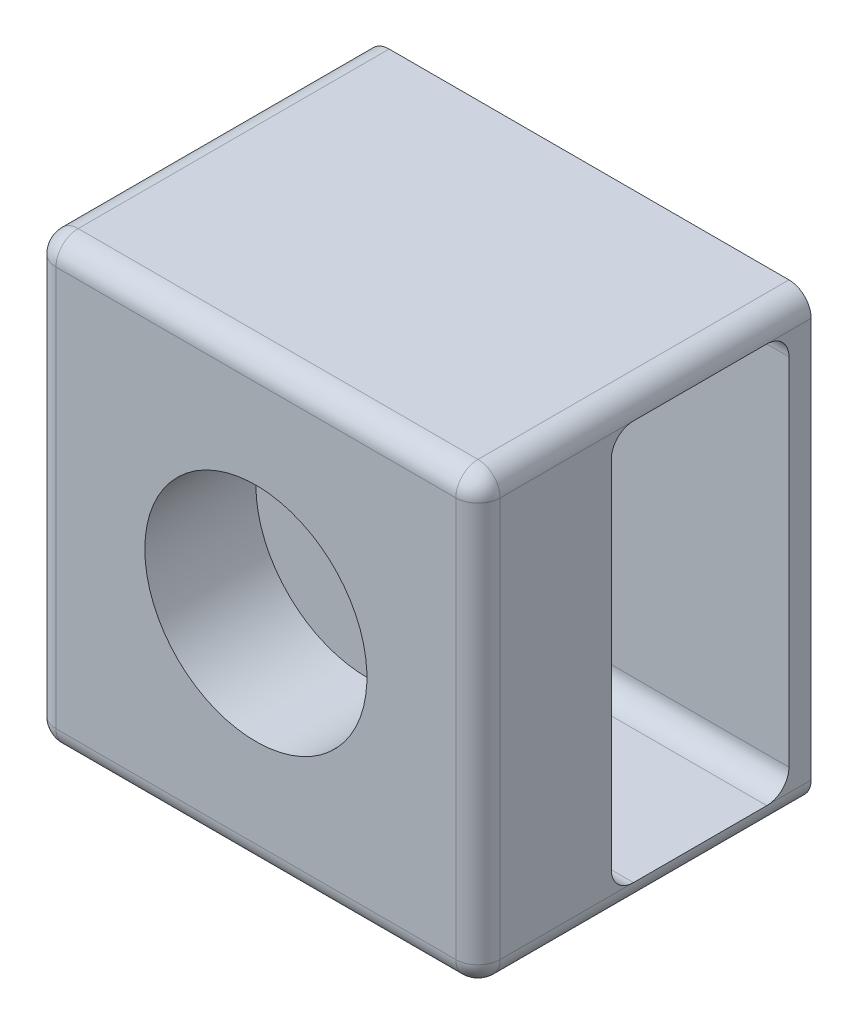
ISO-10303-21;
HEADER;
FILE_DESCRIPTION(('STEP AP214'),'2;1');
FILE_NAME('part.step','',(''),(''),'','','');
FILE_SCHEMA(('AUTOMOTIVE_DESIGN { 1 0 10303 214 1 1 1 1 }'));
ENDSEC;
DATA;
#1=APPLICATION_CONTEXT('core data for automotive mechanical design processes');
#2=APPLICATION_PROTOCOL_DEFINITION('international standard','automotive_design',2000,#1);
#3=PRODUCT_CONTEXT('',#1,'mechanical');
#4=PRODUCT('Part','Part','',(#3));
#5=PRODUCT_RELATED_PRODUCT_CATEGORY('part','',(#4));
#6=PRODUCT_DEFINITION_FORMATION('','',#4);
#7=PRODUCT_DEFINITION_CONTEXT('part definition',#1,'design');
#8=PRODUCT_DEFINITION('design','',#6,#7);
#9=PRODUCT_DEFINITION_SHAPE('','',#8);
#10=(LENGTH_UNIT() NAMED_UNIT(*) SI_UNIT(.MILLI.,.METRE.));
#11=(NAMED_UNIT(*) PLANE_ANGLE_UNIT() SI_UNIT($,.RADIAN.));
#12=(NAMED_UNIT(*) SI_UNIT($,.STERADIAN.) SOLID_ANGLE_UNIT());
#13=UNCERTAINTY_MEASURE_WITH_UNIT(LENGTH_MEASURE(1.E-05),#10,'distance_accuracy_value','');
#14=(GEOMETRIC_REPRESENTATION_CONTEXT(3) GLOBAL_UNCERTAINTY_ASSIGNED_CONTEXT((#13)) GLOBAL_UNIT_ASSIGNED_CONTEXT((#10,
#11,#12)) REPRESENTATION_CONTEXT('',''));
#15=CARTESIAN_POINT('',(0.,0.,0.));
#16=DIRECTION('',(0.,0.,1.));
#17=DIRECTION('',(1.,0.,0.));
#18=AXIS2_PLACEMENT_3D('',#15,#16,#17);
#19=CARTESIAN_POINT('',(-12.7,2.54,-12.7));
#20=DIRECTION('',(1.,0.,0.));
#21=DIRECTION('',(0.,1.,0.));
#22=AXIS2_PLACEMENT_3D('',#19,#20,#21);
#23=PLANE('',#22);
#24=DIRECTION('',(0.,1.,0.));
#25=VECTOR('',#24,1.);
#26=CARTESIAN_POINT('',(-12.7,2.54,-12.7));
#27=LINE('',#26,#25);
#28=CARTESIAN_POINT('',(-12.7,-8.89,-12.7));
#29=VERTEX_POINT('',#28);
#30=CARTESIAN_POINT('',(-12.7,13.97,-12.7));
#31=VERTEX_POINT('',#30);
#32=EDGE_CURVE('E258',#29,#31,#27,.T.);
#33=ORIENTED_EDGE('',*,*,#32,.F.);
#34=DIRECTION('',(0.,0.,1.));
#35=VECTOR('',#34,1.);
#36=CARTESIAN_POINT('',(-12.7,-8.89,-12.7));
#37=LINE('',#36,#35);
#38=CARTESIAN_POINT('',(-12.7,-8.89,-10.16));
#39=VERTEX_POINT('',#38);
#40=EDGE_CURVE('E10',#29,#39,#37,.T.);
#41=ORIENTED_EDGE('',*,*,#40,.T.);
#42=CARTESIAN_POINT('',(-12.7,-7.62,-10.16));
#43=DIRECTION('',(1.,0.,0.));
#44=DIRECTION('',(0.,1.,0.));
#45=AXIS2_PLACEMENT_3D('',#42,#43,#44);
#46=CIRCLE('',#45,1.27);
#47=CARTESIAN_POINT('',(-12.7,-7.62,-11.43));
#48=VERTEX_POINT('',#47);
#49=EDGE_CURVE('E363',#39,#48,#46,.T.);
#50=ORIENTED_EDGE('',*,*,#49,.T.);
#51=DIRECTION('',(0.,-1.,0.));
#52=VECTOR('',#51,1.);
#53=CARTESIAN_POINT('',(-12.7,2.54,-11.43));
#54=LINE('',#53,#52);
#55=CARTESIAN_POINT('',(-12.7,12.7,-11.43));
#56=VERTEX_POINT('',#55);
#57=EDGE_CURVE('E274',#56,#48,#54,.T.);
#58=ORIENTED_EDGE('',*,*,#57,.F.);
#59=CARTESIAN_POINT('',(-12.7,12.7,-10.16));
#60=DIRECTION('',(1.,0.,0.));
#61=DIRECTION('',(0.,1.,0.));
#62=AXIS2_PLACEMENT_3D('',#59,#60,#61);
#63=CIRCLE('',#62,1.27);
#64=CARTESIAN_POINT('',(-12.7,13.97,-10.16));
#65=VERTEX_POINT('',#64);
#66=EDGE_CURVE('E194',#56,#65,#63,.T.);
#67=ORIENTED_EDGE('',*,*,#66,.T.);
#68=DIRECTION('',(0.,0.,1.));
#69=VECTOR('',#68,1.);
#70=CARTESIAN_POINT('',(-12.7,13.97,-12.7));
#71=LINE('',#70,#69);
#72=EDGE_CURVE('E373',#65,#31,#71,.F.);
#73=ORIENTED_EDGE('',*,*,#72,.T.);
#74=EDGE_LOOP('',(#33,#41,#50,#58,#67,#73));
#75=FACE_BOUND('',#74,.T.);
#76=ADVANCED_FACE('F16',(#75),#23,.F.);
#77=CARTESIAN_POINT('',(12.7,2.54,-12.7));
#78=DIRECTION('',(1.,0.,0.));
#79=DIRECTION('',(0.,1.,0.));
#80=AXIS2_PLACEMENT_3D('',#77,#78,#79);
#81=PLANE('',#80);
#82=DIRECTION('',(0.,1.,0.));
#83=VECTOR('',#82,1.);
#84=CARTESIAN_POINT('',(12.7,-10.16,5.08));
#85=LINE('',#84,#83);
#86=CARTESIAN_POINT('',(12.7,13.97,5.08));
#87=VERTEX_POINT('',#86);
#88=CARTESIAN_POINT('',(12.7,-8.89,5.08));
#89=VERTEX_POINT('',#88);
#90=EDGE_CURVE('E39',#87,#89,#85,.F.);
#91=ORIENTED_EDGE('',*,*,#90,.T.);
#92=DIRECTION('',(0.,0.,1.));
#93=VECTOR('',#92,1.);
#94=CARTESIAN_POINT('',(12.7,-8.89,-12.7));
#95=LINE('',#94,#93);
#96=CARTESIAN_POINT('',(12.7,-8.89,-2.54));
#97=VERTEX_POINT('',#96);
#98=EDGE_CURVE('E370',#89,#97,#95,.F.);
#99=ORIENTED_EDGE('',*,*,#98,.T.);
#100=CARTESIAN_POINT('',(12.7,-7.62,-2.54));
#101=DIRECTION('',(1.,0.,0.));
#102=DIRECTION('',(0.,1.,0.));
#103=AXIS2_PLACEMENT_3D('',#100,#101,#102);
#104=CIRCLE('',#103,1.27);
#105=CARTESIAN_POINT('',(12.7,-7.62,-1.27));
#106=VERTEX_POINT('',#105);
#107=EDGE_CURVE('E354',#97,#106,#104,.F.);
#108=ORIENTED_EDGE('',*,*,#107,.T.);
#109=DIRECTION('',(0.,-1.,0.));
#110=VECTOR('',#109,1.);
#111=CARTESIAN_POINT('',(12.7,2.54,-1.27));
#112=LINE('',#111,#110);
#113=CARTESIAN_POINT('',(12.7,12.7,-1.27));
#114=VERTEX_POINT('',#113);
#115=EDGE_CURVE('E225',#114,#106,#112,.T.);
#116=ORIENTED_EDGE('',*,*,#115,.F.);
#117=CARTESIAN_POINT('',(12.7,12.7,-2.54));
#118=DIRECTION('',(1.,0.,0.));
#119=DIRECTION('',(0.,1.,0.));
#120=AXIS2_PLACEMENT_3D('',#117,#118,#119);
#121=CIRCLE('',#120,1.27);
#122=CARTESIAN_POINT('',(12.7,13.97,-2.54));
#123=VERTEX_POINT('',#122);
#124=EDGE_CURVE('E348',#114,#123,#121,.F.);
#125=ORIENTED_EDGE('',*,*,#124,.T.);
#126=DIRECTION('',(0.,0.,1.));
#127=VECTOR('',#126,1.);
#128=CARTESIAN_POINT('',(12.7,13.97,-12.7));
#129=LINE('',#128,#127);
#130=EDGE_CURVE('E48',#123,#87,#129,.T.);
#131=ORIENTED_EDGE('',*,*,#130,.T.);
#132=EDGE_LOOP('',(#91,#99,#108,#116,#125,#131));
#133=FACE_BOUND('',#132,.T.);
#134=ADVANCED_FACE('F492',(#133),#81,.T.);
#135=CARTESIAN_POINT('',(12.7,-7.62,-10.16));
#136=DIRECTION('',(1.,0.,0.));
#137=DIRECTION('',(0.,1.,0.));
#138=AXIS2_PLACEMENT_3D('',#135,#136,#137);
#139=CIRCLE('',#138,1.27);
#140=CARTESIAN_POINT('',(12.7,-7.62,-11.43));
#141=VERTEX_POINT('',#140);
#142=CARTESIAN_POINT('',(12.7,-8.89,-10.16));
#143=VERTEX_POINT('',#142);
#144=EDGE_CURVE('E360',#141,#143,#139,.F.);
#145=ORIENTED_EDGE('',*,*,#144,.T.);
#146=DIRECTION('',(0.,0.,1.));
#147=VECTOR('',#146,1.);
#148=CARTESIAN_POINT('',(12.7,-8.89,-12.7));
#149=LINE('',#148,#147);
#150=CARTESIAN_POINT('',(12.7,-8.89,-12.7));
#151=VERTEX_POINT('',#150);
#152=EDGE_CURVE('E207',#143,#151,#149,.F.);
#153=ORIENTED_EDGE('',*,*,#152,.T.);
#154=DIRECTION('',(0.,1.,0.));
#155=VECTOR('',#154,1.);
#156=CARTESIAN_POINT('',(12.7,2.54,-12.7));
#157=LINE('',#156,#155);
#158=CARTESIAN_POINT('',(12.7,13.97,-12.7));
#159=VERTEX_POINT('',#158);
#160=EDGE_CURVE('E202',#151,#159,#157,.T.);
#161=ORIENTED_EDGE('',*,*,#160,.T.);
#162=DIRECTION('',(0.,0.,1.));
#163=VECTOR('',#162,1.);
#164=CARTESIAN_POINT('',(12.7,13.97,-12.7));
#165=LINE('',#164,#163);
#166=CARTESIAN_POINT('',(12.7,13.97,-10.16));
#167=VERTEX_POINT('',#166);
#168=EDGE_CURVE('E199',#159,#167,#165,.T.);
#169=ORIENTED_EDGE('',*,*,#168,.T.);
#170=CARTESIAN_POINT('',(12.7,12.7,-10.16));
#171=DIRECTION('',(1.,0.,0.));
#172=DIRECTION('',(0.,1.,0.));
#173=AXIS2_PLACEMENT_3D('',#170,#171,#172);
#174=CIRCLE('',#173,1.27);
#175=CARTESIAN_POINT('',(12.7,12.7,-11.43));
#176=VERTEX_POINT('',#175);
#177=EDGE_CURVE('E182',#167,#176,#174,.F.);
#178=ORIENTED_EDGE('',*,*,#177,.T.);
#179=DIRECTION('',(0.,-1.,0.));
#180=VECTOR('',#179,1.);
#181=CARTESIAN_POINT('',(12.7,2.54,-11.43));
#182=LINE('',#181,#180);
#183=EDGE_CURVE('E226',#176,#141,#182,.T.);
#184=ORIENTED_EDGE('',*,*,#183,.T.);
#185=EDGE_LOOP('',(#145,#153,#161,#169,#178,#184));
#186=FACE_BOUND('',#185,.T.);
#187=ADVANCED_FACE('F200',(#186),#81,.T.);
#188=CARTESIAN_POINT('',(-12.7,-7.62,-2.54));
#189=DIRECTION('',(1.,0.,0.));
#190=DIRECTION('',(0.,1.,0.));
#191=AXIS2_PLACEMENT_3D('',#188,#189,#190);
#192=CIRCLE('',#191,1.27);
#193=CARTESIAN_POINT('',(-12.7,-7.62,-1.27));
#194=VERTEX_POINT('',#193);
#195=CARTESIAN_POINT('',(-12.7,-8.89,-2.54));
#196=VERTEX_POINT('',#195);
#197=EDGE_CURVE('E357',#194,#196,#192,.T.);
#198=ORIENTED_EDGE('',*,*,#197,.T.);
#199=DIRECTION('',(0.,0.,1.));
#200=VECTOR('',#199,1.);
#201=CARTESIAN_POINT('',(-12.7,-8.89,-12.7));
#202=LINE('',#201,#200);
#203=CARTESIAN_POINT('',(-12.7,-8.89,5.08));
#204=VERTEX_POINT('',#203);
#205=EDGE_CURVE('E26',#196,#204,#202,.T.);
#206=ORIENTED_EDGE('',*,*,#205,.T.);
#207=DIRECTION('',(0.,1.,0.));
#208=VECTOR('',#207,1.);
#209=CARTESIAN_POINT('',(-12.7,2.54,5.08));
#210=LINE('',#209,#208);
#211=CARTESIAN_POINT('',(-12.7,13.97,5.08));
#212=VERTEX_POINT('',#211);
#213=EDGE_CURVE('E321',#204,#212,#210,.T.);
#214=ORIENTED_EDGE('',*,*,#213,.T.);
#215=DIRECTION('',(0.,0.,1.));
#216=VECTOR('',#215,1.);
#217=CARTESIAN_POINT('',(-12.7,13.97,-12.7));
#218=LINE('',#217,#216);
#219=CARTESIAN_POINT('',(-12.7,13.97,-2.54));
#220=VERTEX_POINT('',#219);
#221=EDGE_CURVE('E376',#212,#220,#218,.F.);
#222=ORIENTED_EDGE('',*,*,#221,.T.);
#223=CARTESIAN_POINT('',(-12.7,12.7,-2.54));
#224=DIRECTION('',(1.,0.,0.));
#225=DIRECTION('',(0.,1.,0.));
#226=AXIS2_PLACEMENT_3D('',#223,#224,#225);
#227=CIRCLE('',#226,1.27);
#228=CARTESIAN_POINT('',(-12.7,12.7,-1.27));
#229=VERTEX_POINT('',#228);
#230=EDGE_CURVE('E351',#220,#229,#227,.T.);
#231=ORIENTED_EDGE('',*,*,#230,.T.);
#232=DIRECTION('',(0.,-1.,0.));
#233=VECTOR('',#232,1.);
#234=CARTESIAN_POINT('',(-12.7,2.54,-1.27));
#235=LINE('',#234,#233);
#236=EDGE_CURVE('E268',#229,#194,#235,.T.);
#237=ORIENTED_EDGE('',*,*,#236,.T.);
#238=EDGE_LOOP('',(#198,#206,#214,#222,#231,#237));
#239=FACE_BOUND('',#238,.T.);
#240=ADVANCED_FACE('F500',(#239),#23,.F.);
#241=CARTESIAN_POINT('',(0.,-10.16,-12.7));
#242=DIRECTION('',(0.,1.,0.));
#243=DIRECTION('',(-1.,0.,0.));
#244=AXIS2_PLACEMENT_3D('',#241,#242,#243);
#245=PLANE('',#244);
#246=DIRECTION('',(-1.,0.,0.));
#247=VECTOR('',#246,1.);
#248=CARTESIAN_POINT('',(0.,-10.16,-12.7));
#249=LINE('',#248,#247);
#250=CARTESIAN_POINT('',(11.43,-10.16,-12.7));
#251=VERTEX_POINT('',#250);
#252=CARTESIAN_POINT('',(-11.43,-10.16,-12.7));
#253=VERTEX_POINT('',#252);
#254=EDGE_CURVE('E254',#251,#253,#249,.T.);
#255=ORIENTED_EDGE('',*,*,#254,.F.);
#256=DIRECTION('',(0.,0.,1.));
#257=VECTOR('',#256,1.);
#258=CARTESIAN_POINT('',(11.43,-10.16,6.35));
#259=LINE('',#258,#257);
#260=CARTESIAN_POINT('',(11.43,-10.16,5.08));
#261=VERTEX_POINT('',#260);
#262=EDGE_CURVE('E330',#251,#261,#259,.T.);
#263=ORIENTED_EDGE('',*,*,#262,.T.);
#264=DIRECTION('',(-1.,0.,0.));
#265=VECTOR('',#264,1.);
#266=CARTESIAN_POINT('',(0.,-10.16,5.08));
#267=LINE('',#266,#265);
#268=CARTESIAN_POINT('',(-11.43,-10.16,5.08));
#269=VERTEX_POINT('',#268);
#270=EDGE_CURVE('E327',#261,#269,#267,.T.);
#271=ORIENTED_EDGE('',*,*,#270,.T.);
#272=DIRECTION('',(0.,0.,1.));
#273=VECTOR('',#272,1.);
#274=CARTESIAN_POINT('',(-11.43,-10.16,-12.7));
#275=LINE('',#274,#273);
#276=EDGE_CURVE('E324',#269,#253,#275,.F.);
#277=ORIENTED_EDGE('',*,*,#276,.T.);
#278=EDGE_LOOP('',(#255,#263,#271,#277));
#279=FACE_BOUND('',#278,.T.);
#280=ADVANCED_FACE('F451',(#279),#245,.F.);
#281=CARTESIAN_POINT('',(0.,15.24,-12.7));
#282=DIRECTION('',(0.,1.,0.));
#283=DIRECTION('',(-1.,0.,0.));
#284=AXIS2_PLACEMENT_3D('',#281,#282,#283);
#285=PLANE('',#284);
#286=DIRECTION('',(-1.,0.,0.));
#287=VECTOR('',#286,1.);
#288=CARTESIAN_POINT('',(0.,15.24,-12.7));
#289=LINE('',#288,#287);
#290=CARTESIAN_POINT('',(11.43,15.24,-12.7));
#291=VERTEX_POINT('',#290);
#292=CARTESIAN_POINT('',(-11.43,15.24,-12.7));
#293=VERTEX_POINT('',#292);
#294=EDGE_CURVE('E251',#291,#293,#289,.T.);
#295=ORIENTED_EDGE('',*,*,#294,.T.);
#296=DIRECTION('',(0.,0.,1.));
#297=VECTOR('',#296,1.);
#298=CARTESIAN_POINT('',(-11.43,15.24,6.35));
#299=LINE('',#298,#297);
#300=CARTESIAN_POINT('',(-11.43,15.24,5.08));
#301=VERTEX_POINT('',#300);
#302=EDGE_CURVE('E319',#293,#301,#299,.T.);
#303=ORIENTED_EDGE('',*,*,#302,.T.);
#304=DIRECTION('',(-1.,0.,0.));
#305=VECTOR('',#304,1.);
#306=CARTESIAN_POINT('',(12.7,15.24,5.08));
#307=LINE('',#306,#305);
#308=CARTESIAN_POINT('',(11.43,15.24,5.08));
#309=VERTEX_POINT('',#308);
#310=EDGE_CURVE('E315',#301,#309,#307,.F.);
#311=ORIENTED_EDGE('',*,*,#310,.T.);
#312=DIRECTION('',(0.,0.,1.));
#313=VECTOR('',#312,1.);
#314=CARTESIAN_POINT('',(11.43,15.24,-12.7));
#315=LINE('',#314,#313);
#316=EDGE_CURVE('E313',#309,#291,#315,.F.);
#317=ORIENTED_EDGE('',*,*,#316,.T.);
#318=EDGE_LOOP('',(#295,#303,#311,#317));
#319=FACE_BOUND('',#318,.T.);
#320=ADVANCED_FACE('F473',(#319),#285,.T.);
#321=CARTESIAN_POINT('',(0.,2.54,-12.7));
#322=DIRECTION('',(0.,0.,-1.));
#323=DIRECTION('',(1.,0.,0.));
#324=AXIS2_PLACEMENT_3D('',#321,#322,#323);
#325=PLANE('',#324);
#326=ORIENTED_EDGE('',*,*,#160,.F.);
#327=CARTESIAN_POINT('',(11.43,-8.89,-12.7));
#328=DIRECTION('',(0.,0.,-1.));
#329=DIRECTION('',(-1.,0.,0.));
#330=AXIS2_PLACEMENT_3D('',#327,#328,#329);
#331=CIRCLE('',#330,1.27);
#332=EDGE_CURVE('E195',#151,#251,#331,.T.);
#333=ORIENTED_EDGE('',*,*,#332,.T.);
#334=ORIENTED_EDGE('',*,*,#254,.T.);
#335=CARTESIAN_POINT('',(-11.43,-8.89,-12.7));
#336=DIRECTION('',(0.,0.,-1.));
#337=DIRECTION('',(-1.,0.,0.));
#338=AXIS2_PLACEMENT_3D('',#335,#336,#337);
#339=CIRCLE('',#338,1.27);
#340=EDGE_CURVE('E341',#253,#29,#339,.T.);
#341=ORIENTED_EDGE('',*,*,#340,.T.);
#342=ORIENTED_EDGE('',*,*,#32,.T.);
#343=CARTESIAN_POINT('',(-11.43,13.97,-12.7));
#344=DIRECTION('',(0.,0.,-1.));
#345=DIRECTION('',(-1.,0.,0.));
#346=AXIS2_PLACEMENT_3D('',#343,#344,#345);
#347=CIRCLE('',#346,1.27);
#348=EDGE_CURVE('E338',#31,#293,#347,.T.);
#349=ORIENTED_EDGE('',*,*,#348,.T.);
#350=ORIENTED_EDGE('',*,*,#294,.F.);
#351=CARTESIAN_POINT('',(11.43,13.97,-12.7));
#352=DIRECTION('',(0.,0.,-1.));
#353=DIRECTION('',(-1.,0.,0.));
#354=AXIS2_PLACEMENT_3D('',#351,#352,#353);
#355=CIRCLE('',#354,1.27);
#356=EDGE_CURVE('E335',#291,#159,#355,.T.);
#357=ORIENTED_EDGE('',*,*,#356,.T.);
#358=EDGE_LOOP('',(#326,#333,#334,#341,#342,#349,#350,#357));
#359=FACE_BOUND('',#358,.T.);
#360=ADVANCED_FACE('F462',(#359),#325,.T.);
#361=CARTESIAN_POINT('',(0.,2.54,6.35));
#362=DIRECTION('',(0.,0.,-1.));
#363=DIRECTION('',(-1.,0.,0.));
#364=AXIS2_PLACEMENT_3D('',#361,#362,#363);
#365=CYLINDRICAL_SURFACE('',#364,6.35);
#366=CARTESIAN_POINT('',(0.,2.54,6.35));
#367=DIRECTION('',(0.,0.,-1.));
#368=DIRECTION('',(-1.,0.,0.));
#369=AXIS2_PLACEMENT_3D('',#366,#367,#368);
#370=CIRCLE('',#369,6.35);
#371=CARTESIAN_POINT('',(-6.35,2.54,6.35));
#372=VERTEX_POINT('',#371);
#373=EDGE_CURVE('E242',#372,#372,#370,.T.);
#374=ORIENTED_EDGE('',*,*,#373,.F.);
#375=EDGE_LOOP('',(#374));
#376=FACE_BOUND('',#375,.T.);
#377=CARTESIAN_POINT('',(0.,2.54,0.));
#378=DIRECTION('',(0.,0.,-1.));
#379=DIRECTION('',(-1.,0.,0.));
#380=AXIS2_PLACEMENT_3D('',#377,#378,#379);
#381=CIRCLE('',#380,6.35);
#382=CARTESIAN_POINT('',(-6.35,2.54,0.));
#383=VERTEX_POINT('',#382);
#384=EDGE_CURVE('E246',#383,#383,#381,.T.);
#385=ORIENTED_EDGE('',*,*,#384,.T.);
#386=EDGE_LOOP('',(#385));
#387=FACE_BOUND('',#386,.T.);
#388=ADVANCED_FACE('F605',(#376,#387),#365,.F.);
#389=CARTESIAN_POINT('',(0.,2.54,6.35));
#390=DIRECTION('',(0.,0.,-1.));
#391=DIRECTION('',(1.,0.,0.));
#392=AXIS2_PLACEMENT_3D('',#389,#390,#391);
#393=PLANE('',#392);
#394=DIRECTION('',(0.,1.,0.));
#395=VECTOR('',#394,1.);
#396=CARTESIAN_POINT('',(11.43,15.24,6.35));
#397=LINE('',#396,#395);
#398=CARTESIAN_POINT('',(11.43,-8.89,6.35));
#399=VERTEX_POINT('',#398);
#400=CARTESIAN_POINT('',(11.43,13.97,6.35));
#401=VERTEX_POINT('',#400);
#402=EDGE_CURVE('E300',#399,#401,#397,.T.);
#403=ORIENTED_EDGE('',*,*,#402,.T.);
#404=DIRECTION('',(-1.,0.,0.));
#405=VECTOR('',#404,1.);
#406=CARTESIAN_POINT('',(-12.7,13.97,6.35));
#407=LINE('',#406,#405);
#408=CARTESIAN_POINT('',(-11.43,13.97,6.35));
#409=VERTEX_POINT('',#408);
#410=EDGE_CURVE('E309',#401,#409,#407,.T.);
#411=ORIENTED_EDGE('',*,*,#410,.T.);
#412=DIRECTION('',(0.,1.,0.));
#413=VECTOR('',#412,1.);
#414=CARTESIAN_POINT('',(-11.43,2.54,6.35));
#415=LINE('',#414,#413);
#416=CARTESIAN_POINT('',(-11.43,-8.89,6.35));
#417=VERTEX_POINT('',#416);
#418=EDGE_CURVE('E306',#409,#417,#415,.F.);
#419=ORIENTED_EDGE('',*,*,#418,.T.);
#420=DIRECTION('',(-1.,0.,0.));
#421=VECTOR('',#420,1.);
#422=CARTESIAN_POINT('',(0.,-8.89,6.35));
#423=LINE('',#422,#421);
#424=EDGE_CURVE('E303',#417,#399,#423,.F.);
#425=ORIENTED_EDGE('',*,*,#424,.T.);
#426=EDGE_LOOP('',(#403,#411,#419,#425));
#427=FACE_BOUND('',#426,.T.);
#428=ORIENTED_EDGE('',*,*,#373,.T.);
#429=EDGE_LOOP('',(#428));
#430=FACE_BOUND('',#429,.T.);
#431=ADVANCED_FACE('F439',(#427,#430),#393,.F.);
#432=CARTESIAN_POINT('',(0.,2.54,0.));
#433=DIRECTION('',(0.,0.,-1.));
#434=DIRECTION('',(1.,0.,0.));
#435=AXIS2_PLACEMENT_3D('',#432,#433,#434);
#436=PLANE('',#435);
#437=CARTESIAN_POINT('',(0.,0.,0.));
#438=DIRECTION('',(0.,0.,-1.));
#439=DIRECTION('',(-1.,0.,0.));
#440=AXIS2_PLACEMENT_3D('',#437,#438,#439);
#441=CIRCLE('',#440,0.635);
#442=CARTESIAN_POINT('',(-0.635,0.,0.));
#443=VERTEX_POINT('',#442);
#444=EDGE_CURVE('E385',#443,#443,#441,.F.);
#445=ORIENTED_EDGE('',*,*,#444,.F.);
#446=EDGE_LOOP('',(#445));
#447=FACE_BOUND('',#446,.T.);
#448=CARTESIAN_POINT('',(0.,5.08000000001,0.));
#449=DIRECTION('',(0.,0.,-1.));
#450=DIRECTION('',(-1.,0.,0.));
#451=AXIS2_PLACEMENT_3D('',#448,#449,#450);
#452=CIRCLE('',#451,0.635);
#453=CARTESIAN_POINT('',(-0.635,5.08000000001,0.));
#454=VERTEX_POINT('',#453);
#455=EDGE_CURVE('E653',#454,#454,#452,.F.);
#456=ORIENTED_EDGE('',*,*,#455,.F.);
#457=EDGE_LOOP('',(#456));
#458=FACE_BOUND('',#457,.T.);
#459=ORIENTED_EDGE('',*,*,#384,.F.);
#460=EDGE_LOOP('',(#459));
#461=FACE_BOUND('',#460,.T.);
#462=ADVANCED_FACE('F591',(#447,#458,#461),#436,.F.);
#463=CARTESIAN_POINT('',(-38.1,2.54,-11.43));
#464=DIRECTION('',(0.,0.,1.));
#465=DIRECTION('',(1.,0.,0.));
#466=AXIS2_PLACEMENT_3D('',#463,#464,#465);
#467=PLANE('',#466);
#468=ORIENTED_EDGE('',*,*,#183,.F.);
#469=DIRECTION('',(1.,0.,0.));
#470=VECTOR('',#469,1.);
#471=CARTESIAN_POINT('',(-38.1,12.7,-11.43));
#472=LINE('',#471,#470);
#473=EDGE_CURVE('E189',#176,#56,#472,.F.);
#474=ORIENTED_EDGE('',*,*,#473,.T.);
#475=ORIENTED_EDGE('',*,*,#57,.T.);
#476=DIRECTION('',(1.,0.,0.));
#477=VECTOR('',#476,1.);
#478=CARTESIAN_POINT('',(12.7,-7.62,-11.43));
#479=LINE('',#478,#477);
#480=EDGE_CURVE('E219',#48,#141,#479,.T.);
#481=ORIENTED_EDGE('',*,*,#480,.T.);
#482=EDGE_LOOP('',(#468,#474,#475,#481));
#483=FACE_BOUND('',#482,.T.);
#484=ADVANCED_FACE('F585',(#483),#467,.T.);
#485=CARTESIAN_POINT('',(-38.1,13.97,-6.35));
#486=DIRECTION('',(0.,1.,0.));
#487=DIRECTION('',(-1.,0.,0.));
#488=AXIS2_PLACEMENT_3D('',#485,#486,#487);
#489=PLANE('',#488);
#490=DIRECTION('',(0.,0.,1.));
#491=VECTOR('',#490,1.);
#492=CARTESIAN_POINT('',(-12.7,13.97,-12.7));
#493=LINE('',#492,#491);
#494=EDGE_CURVE('E217',#65,#220,#493,.T.);
#495=ORIENTED_EDGE('',*,*,#494,.F.);
#496=DIRECTION('',(1.,0.,0.));
#497=VECTOR('',#496,1.);
#498=CARTESIAN_POINT('',(-38.1,13.97,-10.16));
#499=LINE('',#498,#497);
#500=EDGE_CURVE('E187',#65,#167,#499,.T.);
#501=ORIENTED_EDGE('',*,*,#500,.T.);
#502=DIRECTION('',(0.,0.,1.));
#503=VECTOR('',#502,1.);
#504=CARTESIAN_POINT('',(12.7,13.97,-6.35));
#505=LINE('',#504,#503);
#506=EDGE_CURVE('E214',#167,#123,#505,.T.);
#507=ORIENTED_EDGE('',*,*,#506,.T.);
#508=DIRECTION('',(1.,0.,0.));
#509=VECTOR('',#508,1.);
#510=CARTESIAN_POINT('',(-12.7,13.97,-2.54));
#511=LINE('',#510,#509);
#512=EDGE_CURVE('E220',#123,#220,#511,.F.);
#513=ORIENTED_EDGE('',*,*,#512,.T.);
#514=EDGE_LOOP('',(#495,#501,#507,#513));
#515=FACE_BOUND('',#514,.T.);
#516=ADVANCED_FACE('F212',(#515),#489,.F.);
#517=CARTESIAN_POINT('',(-38.1,2.54,-1.27));
#518=DIRECTION('',(0.,0.,1.));
#519=DIRECTION('',(1.,0.,0.));
#520=AXIS2_PLACEMENT_3D('',#517,#518,#519);
#521=PLANE('',#520);
#522=CARTESIAN_POINT('',(0.,0.,-1.27));
#523=DIRECTION('',(0.,0.,-1.));
#524=DIRECTION('',(-1.,0.,0.));
#525=AXIS2_PLACEMENT_3D('',#522,#523,#524);
#526=CIRCLE('',#525,0.635);
#527=CARTESIAN_POINT('',(-0.635,0.,-1.27));
#528=VERTEX_POINT('',#527);
#529=EDGE_CURVE('E649',#528,#528,#526,.T.);
#530=ORIENTED_EDGE('',*,*,#529,.F.);
#531=EDGE_LOOP('',(#530));
#532=FACE_BOUND('',#531,.T.);
#533=CARTESIAN_POINT('',(0.,5.08000000001,-1.27));
#534=DIRECTION('',(0.,0.,-1.));
#535=DIRECTION('',(-1.,0.,0.));
#536=AXIS2_PLACEMENT_3D('',#533,#534,#535);
#537=CIRCLE('',#536,0.635);
#538=CARTESIAN_POINT('',(-0.635,5.08000000001,-1.27));
#539=VERTEX_POINT('',#538);
#540=EDGE_CURVE('E659',#539,#539,#537,.T.);
#541=ORIENTED_EDGE('',*,*,#540,.F.);
#542=EDGE_LOOP('',(#541));
#543=FACE_BOUND('',#542,.T.);
#544=ORIENTED_EDGE('',*,*,#236,.F.);
#545=DIRECTION('',(1.,0.,0.));
#546=VECTOR('',#545,1.);
#547=CARTESIAN_POINT('',(12.7,12.7,-1.27));
#548=LINE('',#547,#546);
#549=EDGE_CURVE('E288',#229,#114,#548,.T.);
#550=ORIENTED_EDGE('',*,*,#549,.T.);
#551=ORIENTED_EDGE('',*,*,#115,.T.);
#552=DIRECTION('',(1.,0.,0.));
#553=VECTOR('',#552,1.);
#554=CARTESIAN_POINT('',(-38.1,-7.62,-1.27));
#555=LINE('',#554,#553);
#556=EDGE_CURVE('E285',#106,#194,#555,.F.);
#557=ORIENTED_EDGE('',*,*,#556,.T.);
#558=EDGE_LOOP('',(#544,#550,#551,#557));
#559=FACE_BOUND('',#558,.T.);
#560=ADVANCED_FACE('F572',(#532,#543,#559),#521,.F.);
#561=CARTESIAN_POINT('',(-38.1,-8.89,-6.35));
#562=DIRECTION('',(0.,1.,0.));
#563=DIRECTION('',(-1.,0.,0.));
#564=AXIS2_PLACEMENT_3D('',#561,#562,#563);
#565=PLANE('',#564);
#566=DIRECTION('',(0.,0.,1.));
#567=VECTOR('',#566,1.);
#568=CARTESIAN_POINT('',(-12.7,-8.89,-12.7));
#569=LINE('',#568,#567);
#570=EDGE_CURVE('E250',#39,#196,#569,.T.);
#571=ORIENTED_EDGE('',*,*,#570,.T.);
#572=DIRECTION('',(1.,0.,0.));
#573=VECTOR('',#572,1.);
#574=CARTESIAN_POINT('',(-38.1,-8.89,-2.54));
#575=LINE('',#574,#573);
#576=EDGE_CURVE('E296',#196,#97,#575,.T.);
#577=ORIENTED_EDGE('',*,*,#576,.T.);
#578=DIRECTION('',(0.,0.,1.));
#579=VECTOR('',#578,1.);
#580=CARTESIAN_POINT('',(12.7,-8.89,-6.35));
#581=LINE('',#580,#579);
#582=EDGE_CURVE('E233',#143,#97,#581,.T.);
#583=ORIENTED_EDGE('',*,*,#582,.F.);
#584=DIRECTION('',(1.,0.,0.));
#585=VECTOR('',#584,1.);
#586=CARTESIAN_POINT('',(-12.7,-8.89,-10.16));
#587=LINE('',#586,#585);
#588=EDGE_CURVE('E292',#143,#39,#587,.F.);
#589=ORIENTED_EDGE('',*,*,#588,.T.);
#590=EDGE_LOOP('',(#571,#577,#583,#589));
#591=FACE_BOUND('',#590,.T.);
#592=ADVANCED_FACE('F483',(#591),#565,.T.);
#593=CARTESIAN_POINT('',(-38.1,12.7,-10.16));
#594=DIRECTION('',(1.,0.,0.));
#595=DIRECTION('',(0.,1.,0.));
#596=AXIS2_PLACEMENT_3D('',#593,#594,#595);
#597=CYLINDRICAL_SURFACE('',#596,1.27);
#598=ORIENTED_EDGE('',*,*,#66,.F.);
#599=ORIENTED_EDGE('',*,*,#473,.F.);
#600=ORIENTED_EDGE('',*,*,#177,.F.);
#601=ORIENTED_EDGE('',*,*,#500,.F.);
#602=EDGE_LOOP('',(#598,#599,#600,#601));
#603=FACE_BOUND('',#602,.T.);
#604=ADVANCED_FACE('F185',(#603),#597,.F.);
#605=CARTESIAN_POINT('',(-38.1,12.7,-2.54));
#606=DIRECTION('',(-1.,0.,0.));
#607=DIRECTION('',(0.,-1.,0.));
#608=AXIS2_PLACEMENT_3D('',#605,#606,#607);
#609=CYLINDRICAL_SURFACE('',#608,1.27);
#610=ORIENTED_EDGE('',*,*,#230,.F.);
#611=ORIENTED_EDGE('',*,*,#512,.F.);
#612=ORIENTED_EDGE('',*,*,#124,.F.);
#613=ORIENTED_EDGE('',*,*,#549,.F.);
#614=EDGE_LOOP('',(#610,#611,#612,#613));
#615=FACE_BOUND('',#614,.T.);
#616=ADVANCED_FACE('F506',(#615),#609,.F.);
#617=CARTESIAN_POINT('',(-38.1,-7.62,-2.54));
#618=DIRECTION('',(1.,0.,0.));
#619=DIRECTION('',(0.,1.,0.));
#620=AXIS2_PLACEMENT_3D('',#617,#618,#619);
#621=CYLINDRICAL_SURFACE('',#620,1.27);
#622=ORIENTED_EDGE('',*,*,#197,.F.);
#623=ORIENTED_EDGE('',*,*,#556,.F.);
#624=ORIENTED_EDGE('',*,*,#107,.F.);
#625=ORIENTED_EDGE('',*,*,#576,.F.);
#626=EDGE_LOOP('',(#622,#623,#624,#625));
#627=FACE_BOUND('',#626,.T.);
#628=ADVANCED_FACE('F489',(#627),#621,.F.);
#629=CARTESIAN_POINT('',(-38.1,-7.62,-10.16));
#630=DIRECTION('',(-1.,0.,0.));
#631=DIRECTION('',(0.,-1.,0.));
#632=AXIS2_PLACEMENT_3D('',#629,#630,#631);
#633=CYLINDRICAL_SURFACE('',#632,1.27);
#634=ORIENTED_EDGE('',*,*,#49,.F.);
#635=ORIENTED_EDGE('',*,*,#588,.F.);
#636=ORIENTED_EDGE('',*,*,#144,.F.);
#637=ORIENTED_EDGE('',*,*,#480,.F.);
#638=EDGE_LOOP('',(#634,#635,#636,#637));
#639=FACE_BOUND('',#638,.T.);
#640=ADVANCED_FACE('F486',(#639),#633,.F.);
#641=CARTESIAN_POINT('',(11.43,-8.89,-12.7));
#642=DIRECTION('',(0.,0.,-1.));
#643=DIRECTION('',(-1.,0.,0.));
#644=AXIS2_PLACEMENT_3D('',#641,#642,#643);
#645=CYLINDRICAL_SURFACE('',#644,1.27);
#646=ORIENTED_EDGE('',*,*,#582,.T.);
#647=ORIENTED_EDGE('',*,*,#98,.F.);
#648=CARTESIAN_POINT('',(11.43,-8.89,5.08));
#649=DIRECTION('',(0.,0.,1.));
#650=DIRECTION('',(1.,0.,0.));
#651=AXIS2_PLACEMENT_3D('',#648,#649,#650);
#652=CIRCLE('',#651,1.27);
#653=EDGE_CURVE('E20',#261,#89,#652,.T.);
#654=ORIENTED_EDGE('',*,*,#653,.F.);
#655=ORIENTED_EDGE('',*,*,#262,.F.);
#656=ORIENTED_EDGE('',*,*,#332,.F.);
#657=ORIENTED_EDGE('',*,*,#152,.F.);
#658=EDGE_LOOP('',(#646,#647,#654,#655,#656,#657));
#659=FACE_BOUND('',#658,.T.);
#660=ADVANCED_FACE('F18',(#659),#645,.T.);
#661=CARTESIAN_POINT('',(0.,-8.89,5.08));
#662=DIRECTION('',(-1.,0.,0.));
#663=DIRECTION('',(0.,-1.,0.));
#664=AXIS2_PLACEMENT_3D('',#661,#662,#663);
#665=CYLINDRICAL_SURFACE('',#664,1.27);
#666=CARTESIAN_POINT('',(-11.43,-8.89,5.08));
#667=DIRECTION('',(-1.,0.,0.));
#668=DIRECTION('',(0.,0.,1.));
#669=AXIS2_PLACEMENT_3D('',#666,#667,#668);
#670=CIRCLE('',#669,1.27);
#671=EDGE_CURVE('E416',#269,#417,#670,.T.);
#672=ORIENTED_EDGE('',*,*,#671,.F.);
#673=ORIENTED_EDGE('',*,*,#270,.F.);
#674=CARTESIAN_POINT('',(11.43,-8.89,5.08));
#675=DIRECTION('',(1.,0.,0.));
#676=DIRECTION('',(0.,1.,0.));
#677=AXIS2_PLACEMENT_3D('',#674,#675,#676);
#678=CIRCLE('',#677,1.27);
#679=EDGE_CURVE('E419',#399,#261,#678,.T.);
#680=ORIENTED_EDGE('',*,*,#679,.F.);
#681=ORIENTED_EDGE('',*,*,#424,.F.);
#682=EDGE_LOOP('',(#672,#673,#680,#681));
#683=FACE_BOUND('',#682,.T.);
#684=ADVANCED_FACE('F447',(#683),#665,.T.);
#685=CARTESIAN_POINT('',(-11.43,-8.89,-12.7));
#686=DIRECTION('',(0.,0.,1.));
#687=DIRECTION('',(1.,0.,0.));
#688=AXIS2_PLACEMENT_3D('',#685,#686,#687);
#689=CYLINDRICAL_SURFACE('',#688,1.27);
#690=ORIENTED_EDGE('',*,*,#340,.F.);
#691=ORIENTED_EDGE('',*,*,#276,.F.);
#692=CARTESIAN_POINT('',(-11.43,-8.89,5.08));
#693=DIRECTION('',(0.,0.,1.));
#694=DIRECTION('',(1.,0.,0.));
#695=AXIS2_PLACEMENT_3D('',#692,#693,#694);
#696=CIRCLE('',#695,1.27);
#697=EDGE_CURVE('E412',#204,#269,#696,.T.);
#698=ORIENTED_EDGE('',*,*,#697,.F.);
#699=ORIENTED_EDGE('',*,*,#205,.F.);
#700=ORIENTED_EDGE('',*,*,#570,.F.);
#701=ORIENTED_EDGE('',*,*,#40,.F.);
#702=EDGE_LOOP('',(#690,#691,#698,#699,#700,#701));
#703=FACE_BOUND('',#702,.T.);
#704=ADVANCED_FACE('F455',(#703),#689,.T.);
#705=CARTESIAN_POINT('',(11.43,-8.89,5.08));
#706=DIRECTION('',(0.,0.,1.));
#707=DIRECTION('',(1.,0.,0.));
#708=AXIS2_PLACEMENT_3D('',#705,#706,#707);
#709=SPHERICAL_SURFACE('',#708,1.27);
#710=ORIENTED_EDGE('',*,*,#679,.T.);
#711=ORIENTED_EDGE('',*,*,#653,.T.);
#712=CARTESIAN_POINT('',(11.43,-8.89,5.08));
#713=DIRECTION('',(0.,-1.,0.));
#714=DIRECTION('',(0.,0.,-1.));
#715=AXIS2_PLACEMENT_3D('',#712,#713,#714);
#716=CIRCLE('',#715,1.27);
#717=EDGE_CURVE('E408',#399,#89,#716,.F.);
#718=ORIENTED_EDGE('',*,*,#717,.F.);
#719=EDGE_LOOP('',(#710,#711,#718));
#720=FACE_BOUND('',#719,.T.);
#721=ADVANCED_FACE('F430',(#720),#709,.T.);
#722=CARTESIAN_POINT('',(-11.43,-8.89,5.08));
#723=DIRECTION('',(0.,0.,1.));
#724=DIRECTION('',(1.,0.,0.));
#725=AXIS2_PLACEMENT_3D('',#722,#723,#724);
#726=SPHERICAL_SURFACE('',#725,1.27);
#727=ORIENTED_EDGE('',*,*,#697,.T.);
#728=ORIENTED_EDGE('',*,*,#671,.T.);
#729=CARTESIAN_POINT('',(-11.43,-8.89,5.08));
#730=DIRECTION('',(0.,-1.,0.));
#731=DIRECTION('',(1.,0.,0.));
#732=AXIS2_PLACEMENT_3D('',#729,#730,#731);
#733=CIRCLE('',#732,1.27);
#734=EDGE_CURVE('E404',#204,#417,#733,.F.);
#735=ORIENTED_EDGE('',*,*,#734,.F.);
#736=EDGE_LOOP('',(#727,#728,#735));
#737=FACE_BOUND('',#736,.T.);
#738=ADVANCED_FACE('F537',(#737),#726,.T.);
#739=CARTESIAN_POINT('',(11.43,13.97,-12.7));
#740=DIRECTION('',(0.,0.,1.));
#741=DIRECTION('',(1.,0.,0.));
#742=AXIS2_PLACEMENT_3D('',#739,#740,#741);
#743=CYLINDRICAL_SURFACE('',#742,1.27);
#744=ORIENTED_EDGE('',*,*,#356,.F.);
#745=ORIENTED_EDGE('',*,*,#316,.F.);
#746=CARTESIAN_POINT('',(11.43,13.97,5.08));
#747=DIRECTION('',(0.,0.,1.));
#748=DIRECTION('',(1.,0.,0.));
#749=AXIS2_PLACEMENT_3D('',#746,#747,#748);
#750=CIRCLE('',#749,1.27);
#751=EDGE_CURVE('E400',#87,#309,#750,.T.);
#752=ORIENTED_EDGE('',*,*,#751,.F.);
#753=ORIENTED_EDGE('',*,*,#130,.F.);
#754=ORIENTED_EDGE('',*,*,#506,.F.);
#755=ORIENTED_EDGE('',*,*,#168,.F.);
#756=EDGE_LOOP('',(#744,#745,#752,#753,#754,#755));
#757=FACE_BOUND('',#756,.T.);
#758=ADVANCED_FACE('F222',(#757),#743,.T.);
#759=CARTESIAN_POINT('',(11.43,2.54,5.08));
#760=DIRECTION('',(0.,-1.,0.));
#761=DIRECTION('',(1.,0.,0.));
#762=AXIS2_PLACEMENT_3D('',#759,#760,#761);
#763=CYLINDRICAL_SURFACE('',#762,1.27);
#764=ORIENTED_EDGE('',*,*,#717,.T.);
#765=ORIENTED_EDGE('',*,*,#90,.F.);
#766=CARTESIAN_POINT('',(11.43,13.97,5.08));
#767=DIRECTION('',(0.,1.,0.));
#768=DIRECTION('',(-1.,0.,0.));
#769=AXIS2_PLACEMENT_3D('',#766,#767,#768);
#770=CIRCLE('',#769,1.27);
#771=EDGE_CURVE('E396',#401,#87,#770,.T.);
#772=ORIENTED_EDGE('',*,*,#771,.F.);
#773=ORIENTED_EDGE('',*,*,#402,.F.);
#774=EDGE_LOOP('',(#764,#765,#772,#773));
#775=FACE_BOUND('',#774,.T.);
#776=ADVANCED_FACE('F435',(#775),#763,.T.);
#777=CARTESIAN_POINT('',(-11.43,2.54,5.08));
#778=DIRECTION('',(0.,1.,0.));
#779=DIRECTION('',(-1.,0.,0.));
#780=AXIS2_PLACEMENT_3D('',#777,#778,#779);
#781=CYLINDRICAL_SURFACE('',#780,1.27);
#782=ORIENTED_EDGE('',*,*,#734,.T.);
#783=ORIENTED_EDGE('',*,*,#418,.F.);
#784=CARTESIAN_POINT('',(-11.43,13.97,5.08));
#785=DIRECTION('',(0.,1.,0.));
#786=DIRECTION('',(0.,0.,1.));
#787=AXIS2_PLACEMENT_3D('',#784,#785,#786);
#788=CIRCLE('',#787,1.27);
#789=EDGE_CURVE('E392',#212,#409,#788,.T.);
#790=ORIENTED_EDGE('',*,*,#789,.F.);
#791=ORIENTED_EDGE('',*,*,#213,.F.);
#792=EDGE_LOOP('',(#782,#783,#790,#791));
#793=FACE_BOUND('',#792,.T.);
#794=ADVANCED_FACE('F529',(#793),#781,.T.);
#795=CARTESIAN_POINT('',(-11.43,13.97,-12.7));
#796=DIRECTION('',(0.,0.,-1.));
#797=DIRECTION('',(-1.,0.,0.));
#798=AXIS2_PLACEMENT_3D('',#795,#796,#797);
#799=CYLINDRICAL_SURFACE('',#798,1.27);
#800=ORIENTED_EDGE('',*,*,#494,.T.);
#801=ORIENTED_EDGE('',*,*,#221,.F.);
#802=CARTESIAN_POINT('',(-11.43,13.97,5.08));
#803=DIRECTION('',(0.,0.,1.));
#804=DIRECTION('',(1.,0.,0.));
#805=AXIS2_PLACEMENT_3D('',#802,#803,#804);
#806=CIRCLE('',#805,1.27);
#807=EDGE_CURVE('E388',#301,#212,#806,.T.);
#808=ORIENTED_EDGE('',*,*,#807,.F.);
#809=ORIENTED_EDGE('',*,*,#302,.F.);
#810=ORIENTED_EDGE('',*,*,#348,.F.);
#811=ORIENTED_EDGE('',*,*,#72,.F.);
#812=EDGE_LOOP('',(#800,#801,#808,#809,#810,#811));
#813=FACE_BOUND('',#812,.T.);
#814=ADVANCED_FACE('F467',(#813),#799,.T.);
#815=CARTESIAN_POINT('',(11.43,13.97,5.08));
#816=DIRECTION('',(0.,0.,1.));
#817=DIRECTION('',(1.,0.,0.));
#818=AXIS2_PLACEMENT_3D('',#815,#816,#817);
#819=SPHERICAL_SURFACE('',#818,1.27);
#820=ORIENTED_EDGE('',*,*,#771,.T.);
#821=ORIENTED_EDGE('',*,*,#751,.T.);
#822=CARTESIAN_POINT('',(11.43,13.97,5.08));
#823=DIRECTION('',(1.,0.,0.));
#824=DIRECTION('',(0.,0.,-1.));
#825=AXIS2_PLACEMENT_3D('',#822,#823,#824);
#826=CIRCLE('',#825,1.27);
#827=EDGE_CURVE('E384',#401,#309,#826,.F.);
#828=ORIENTED_EDGE('',*,*,#827,.F.);
#829=EDGE_LOOP('',(#820,#821,#828));
#830=FACE_BOUND('',#829,.T.);
#831=ADVANCED_FACE('F522',(#830),#819,.T.);
#832=CARTESIAN_POINT('',(-11.43,13.97,5.08));
#833=DIRECTION('',(0.,0.,1.));
#834=DIRECTION('',(1.,0.,0.));
#835=AXIS2_PLACEMENT_3D('',#832,#833,#834);
#836=SPHERICAL_SURFACE('',#835,1.27);
#837=ORIENTED_EDGE('',*,*,#807,.T.);
#838=ORIENTED_EDGE('',*,*,#789,.T.);
#839=CARTESIAN_POINT('',(-11.43,13.97,5.08));
#840=DIRECTION('',(-1.,0.,0.));
#841=DIRECTION('',(0.,-1.,0.));
#842=AXIS2_PLACEMENT_3D('',#839,#840,#841);
#843=CIRCLE('',#842,1.27);
#844=EDGE_CURVE('E381',#301,#409,#843,.F.);
#845=ORIENTED_EDGE('',*,*,#844,.F.);
#846=EDGE_LOOP('',(#837,#838,#845));
#847=FACE_BOUND('',#846,.T.);
#848=ADVANCED_FACE('F518',(#847),#836,.T.);
#849=CARTESIAN_POINT('',(0.,13.97,5.08));
#850=DIRECTION('',(1.,0.,0.));
#851=DIRECTION('',(0.,1.,0.));
#852=AXIS2_PLACEMENT_3D('',#849,#850,#851);
#853=CYLINDRICAL_SURFACE('',#852,1.27);
#854=ORIENTED_EDGE('',*,*,#827,.T.);
#855=ORIENTED_EDGE('',*,*,#310,.F.);
#856=ORIENTED_EDGE('',*,*,#844,.T.);
#857=ORIENTED_EDGE('',*,*,#410,.F.);
#858=EDGE_LOOP('',(#854,#855,#856,#857));
#859=FACE_BOUND('',#858,.T.);
#860=ADVANCED_FACE('F514',(#859),#853,.T.);
#861=CARTESIAN_POINT('',(0.,5.08000000001,0.00200000000000005));
#862=DIRECTION('',(0.,0.,-1.));
#863=DIRECTION('',(-1.,0.,0.));
#864=AXIS2_PLACEMENT_3D('',#861,#862,#863);
#865=CYLINDRICAL_SURFACE('',#864,0.635);
#866=ORIENTED_EDGE('',*,*,#455,.T.);
#867=EDGE_LOOP('',(#866));
#868=FACE_BOUND('',#867,.T.);
#869=ORIENTED_EDGE('',*,*,#540,.T.);
#870=EDGE_LOOP('',(#869));
#871=FACE_BOUND('',#870,.T.);
#872=ADVANCED_FACE('F517',(#868,#871),#865,.F.);
#873=CARTESIAN_POINT('',(0.,0.,0.00200000000000005));
#874=DIRECTION('',(0.,0.,-1.));
#875=DIRECTION('',(-1.,0.,0.));
#876=AXIS2_PLACEMENT_3D('',#873,#874,#875);
#877=CYLINDRICAL_SURFACE('',#876,0.635);
#878=ORIENTED_EDGE('',*,*,#444,.T.);
#879=EDGE_LOOP('',(#878));
#880=FACE_BOUND('',#879,.T.);
#881=ORIENTED_EDGE('',*,*,#529,.T.);
#882=EDGE_LOOP('',(#881));
#883=FACE_BOUND('',#882,.T.);
#884=ADVANCED_FACE('F667',(#880,#883),#877,.F.);
#885=CLOSED_SHELL('',(#76,#134,#187,#240,#280,#320,#360,#388,#431,#462,#484,#516,#560,#592,#604,
#616,#628,#640,#660,#684,#704,#721,#738,#758,#776,#794,#814,#831,#848,#860,#872,#884));
#886=MANIFOLD_SOLID_BREP('B1',#885);
#887=ADVANCED_BREP_SHAPE_REPRESENTATION('',(#18,#886),#14);
#888=SHAPE_DEFINITION_REPRESENTATION(#9,#887);
ENDSEC;
END-ISO-10303-21;
